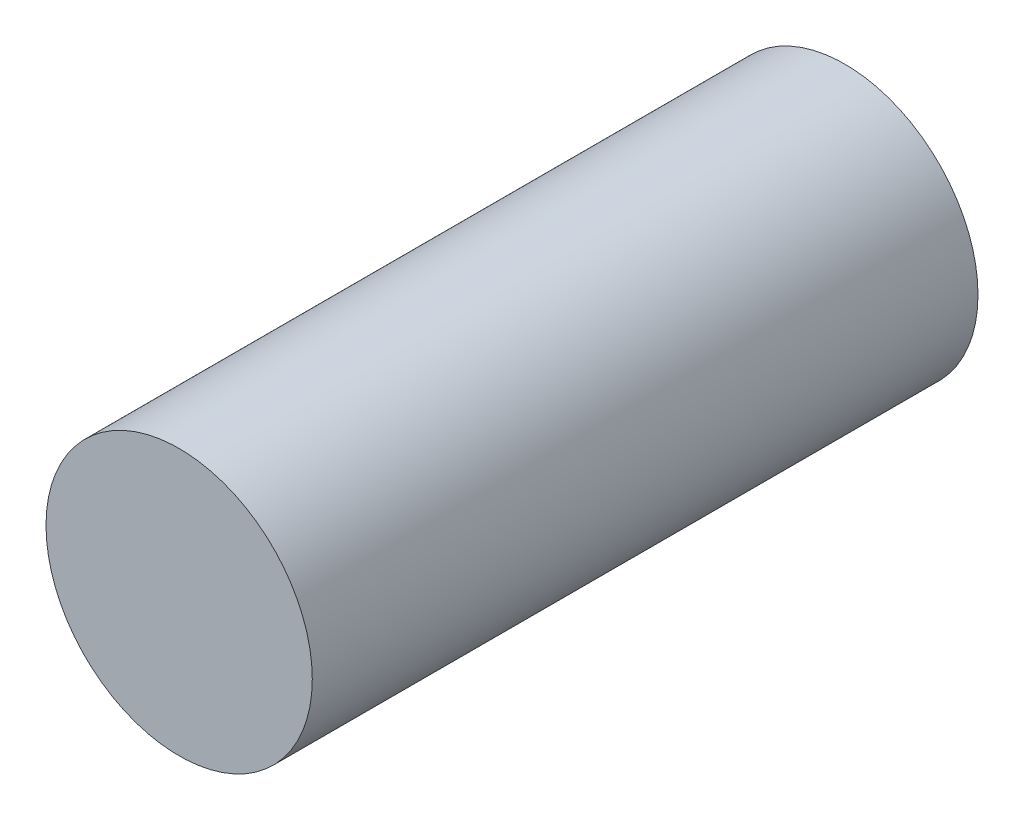
ISO-10303-21;
HEADER;
FILE_DESCRIPTION(('STEP AP214'),'2;1');
FILE_NAME('part.step','',(''),(''),'','','');
FILE_SCHEMA(('AUTOMOTIVE_DESIGN { 1 0 10303 214 1 1 1 1 }'));
ENDSEC;
DATA;
#1=APPLICATION_CONTEXT('core data for automotive mechanical design processes');
#2=APPLICATION_PROTOCOL_DEFINITION('international standard','automotive_design',2000,#1);
#3=PRODUCT_CONTEXT('',#1,'mechanical');
#4=PRODUCT('Part','Part','',(#3));
#5=PRODUCT_RELATED_PRODUCT_CATEGORY('part','',(#4));
#6=PRODUCT_DEFINITION_FORMATION('','',#4);
#7=PRODUCT_DEFINITION_CONTEXT('part definition',#1,'design');
#8=PRODUCT_DEFINITION('design','',#6,#7);
#9=PRODUCT_DEFINITION_SHAPE('','',#8);
#10=(LENGTH_UNIT() NAMED_UNIT(*) SI_UNIT(.MILLI.,.METRE.));
#11=(NAMED_UNIT(*) PLANE_ANGLE_UNIT() SI_UNIT($,.RADIAN.));
#12=(NAMED_UNIT(*) SI_UNIT($,.STERADIAN.) SOLID_ANGLE_UNIT());
#13=UNCERTAINTY_MEASURE_WITH_UNIT(LENGTH_MEASURE(1.E-05),#10,'distance_accuracy_value','');
#14=(GEOMETRIC_REPRESENTATION_CONTEXT(3) GLOBAL_UNCERTAINTY_ASSIGNED_CONTEXT((#13)) GLOBAL_UNIT_ASSIGNED_CONTEXT((#10,
#11,#12)) REPRESENTATION_CONTEXT('',''));
#15=CARTESIAN_POINT('',(0.,0.,0.));
#16=DIRECTION('',(0.,0.,1.));
#17=DIRECTION('',(1.,0.,0.));
#18=AXIS2_PLACEMENT_3D('',#15,#16,#17);
#19=CARTESIAN_POINT('',(0.,0.,30.));
#20=DIRECTION('',(0.,0.,-1.));
#21=DIRECTION('',(-1.,0.,0.));
#22=AXIS2_PLACEMENT_3D('',#19,#20,#21);
#23=CYLINDRICAL_SURFACE('',#22,6.);
#24=CARTESIAN_POINT('',(0.,0.,30.));
#25=DIRECTION('',(0.,0.,1.));
#26=DIRECTION('',(1.,0.,0.));
#27=AXIS2_PLACEMENT_3D('',#24,#25,#26);
#28=CIRCLE('',#27,6.);
#29=CARTESIAN_POINT('',(6.,0.,30.));
#30=VERTEX_POINT('',#29);
#31=EDGE_CURVE('E10',#30,#30,#28,.T.);
#32=ORIENTED_EDGE('',*,*,#31,.F.);
#33=EDGE_LOOP('',(#32));
#34=FACE_BOUND('',#33,.T.);
#35=CARTESIAN_POINT('',(0.,0.,0.));
#36=DIRECTION('',(0.,0.,1.));
#37=DIRECTION('',(1.,0.,0.));
#38=AXIS2_PLACEMENT_3D('',#35,#36,#37);
#39=CIRCLE('',#38,6.);
#40=CARTESIAN_POINT('',(6.,0.,0.));
#41=VERTEX_POINT('',#40);
#42=EDGE_CURVE('E33',#41,#41,#39,.T.);
#43=ORIENTED_EDGE('',*,*,#42,.T.);
#44=EDGE_LOOP('',(#43));
#45=FACE_BOUND('',#44,.T.);
#46=ADVANCED_FACE('F30',(#34,#45),#23,.T.);
#47=CARTESIAN_POINT('',(0.,0.,30.));
#48=DIRECTION('',(0.,0.,1.));
#49=DIRECTION('',(1.,0.,0.));
#50=AXIS2_PLACEMENT_3D('',#47,#48,#49);
#51=PLANE('',#50);
#52=ORIENTED_EDGE('',*,*,#31,.T.);
#53=EDGE_LOOP('',(#52));
#54=FACE_BOUND('',#53,.T.);
#55=ADVANCED_FACE('F45',(#54),#51,.T.);
#56=CARTESIAN_POINT('',(0.,0.,0.));
#57=DIRECTION('',(0.,0.,1.));
#58=DIRECTION('',(1.,0.,0.));
#59=AXIS2_PLACEMENT_3D('',#56,#57,#58);
#60=PLANE('',#59);
#61=ORIENTED_EDGE('',*,*,#42,.F.);
#62=EDGE_LOOP('',(#61));
#63=FACE_BOUND('',#62,.T.);
#64=ADVANCED_FACE('F43',(#63),#60,.F.);
#65=CLOSED_SHELL('',(#46,#55,#64));
#66=MANIFOLD_SOLID_BREP('B2',#65);
#67=ADVANCED_BREP_SHAPE_REPRESENTATION('',(#18,#66),#14);
#68=SHAPE_DEFINITION_REPRESENTATION(#9,#67);
ENDSEC;
END-ISO-10303-21;
